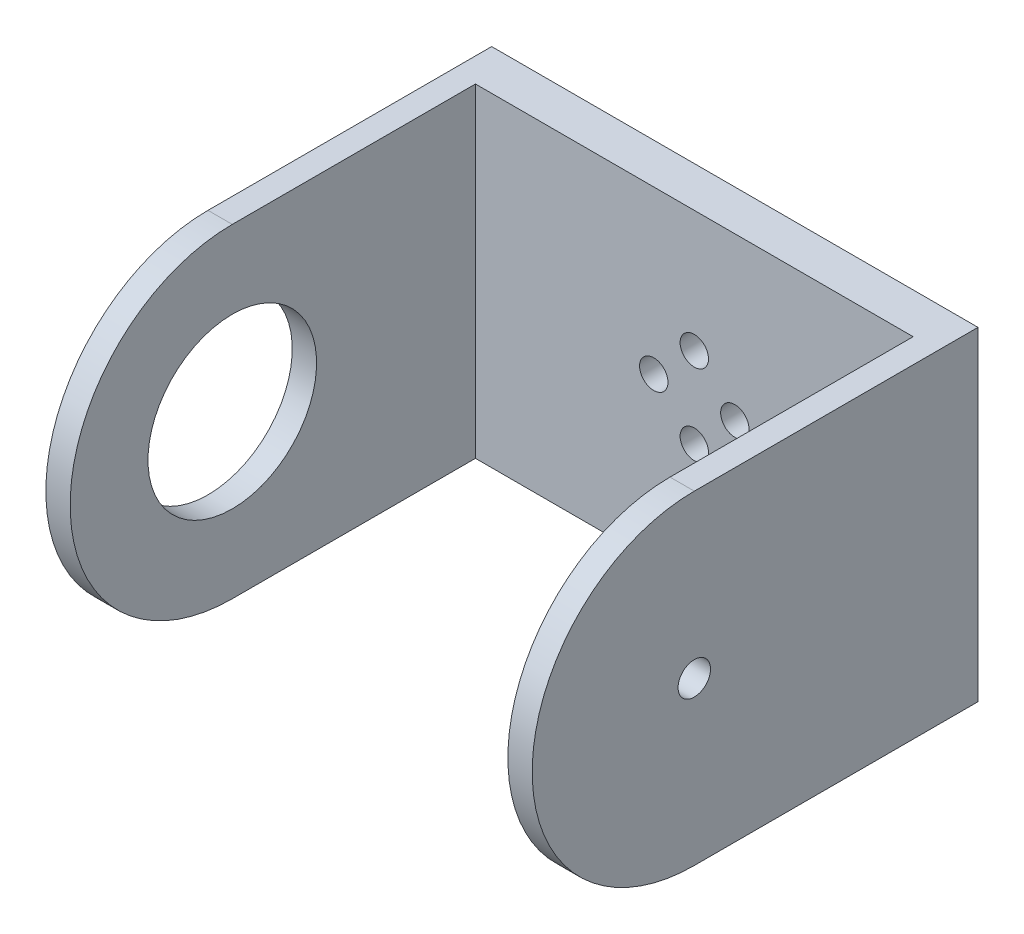
ISO-10303-21;
HEADER;
FILE_DESCRIPTION(('STEP AP214'),'2;1');
FILE_NAME('part.step','',(''),(''),'','','');
FILE_SCHEMA(('AUTOMOTIVE_DESIGN { 1 0 10303 214 1 1 1 1 }'));
ENDSEC;
DATA;
#1=APPLICATION_CONTEXT('core data for automotive mechanical design processes');
#2=APPLICATION_PROTOCOL_DEFINITION('international standard','automotive_design',2000,#1);
#3=PRODUCT_CONTEXT('',#1,'mechanical');
#4=PRODUCT('Part','Part','',(#3));
#5=PRODUCT_RELATED_PRODUCT_CATEGORY('part','',(#4));
#6=PRODUCT_DEFINITION_FORMATION('','',#4);
#7=PRODUCT_DEFINITION_CONTEXT('part definition',#1,'design');
#8=PRODUCT_DEFINITION('design','',#6,#7);
#9=PRODUCT_DEFINITION_SHAPE('','',#8);
#10=(LENGTH_UNIT() NAMED_UNIT(*) SI_UNIT(.MILLI.,.METRE.));
#11=(NAMED_UNIT(*) PLANE_ANGLE_UNIT() SI_UNIT($,.RADIAN.));
#12=(NAMED_UNIT(*) SI_UNIT($,.STERADIAN.) SOLID_ANGLE_UNIT());
#13=UNCERTAINTY_MEASURE_WITH_UNIT(LENGTH_MEASURE(1.E-05),#10,'distance_accuracy_value','');
#14=(GEOMETRIC_REPRESENTATION_CONTEXT(3) GLOBAL_UNCERTAINTY_ASSIGNED_CONTEXT((#13)) GLOBAL_UNIT_ASSIGNED_CONTEXT((#10,
#11,#12)) REPRESENTATION_CONTEXT('',''));
#15=CARTESIAN_POINT('',(0.,0.,0.));
#16=DIRECTION('',(0.,0.,1.));
#17=DIRECTION('',(1.,0.,0.));
#18=AXIS2_PLACEMENT_3D('',#15,#16,#17);
#19=CARTESIAN_POINT('',(30.,20.,5.));
#20=DIRECTION('',(-1.,0.,0.));
#21=DIRECTION('',(0.,-1.,0.));
#22=AXIS2_PLACEMENT_3D('',#19,#20,#21);
#23=PLANE('',#22);
#24=CARTESIAN_POINT('',(30.,0.,35.));
#25=DIRECTION('',(1.,0.,0.));
#26=DIRECTION('',(0.,1.,0.));
#27=AXIS2_PLACEMENT_3D('',#24,#25,#26);
#28=CIRCLE('',#27,2.);
#29=CARTESIAN_POINT('',(30.,1.99999999999999,35.));
#30=VERTEX_POINT('',#29);
#31=EDGE_CURVE('E247',#30,#30,#28,.T.);
#32=ORIENTED_EDGE('',*,*,#31,.F.);
#33=EDGE_LOOP('',(#32));
#34=FACE_BOUND('',#33,.T.);
#35=DIRECTION('',(0.,1.,0.));
#36=VECTOR('',#35,1.);
#37=CARTESIAN_POINT('',(30.,20.,0.));
#38=LINE('',#37,#36);
#39=CARTESIAN_POINT('',(30.,-20.,0.));
#40=VERTEX_POINT('',#39);
#41=CARTESIAN_POINT('',(30.,20.,0.));
#42=VERTEX_POINT('',#41);
#43=EDGE_CURVE('E170',#40,#42,#38,.T.);
#44=ORIENTED_EDGE('',*,*,#43,.T.);
#45=DIRECTION('',(0.,0.,-1.));
#46=VECTOR('',#45,1.);
#47=CARTESIAN_POINT('',(30.,20.,5.));
#48=LINE('',#47,#46);
#49=CARTESIAN_POINT('',(30.,20.,35.));
#50=VERTEX_POINT('',#49);
#51=EDGE_CURVE('E11',#50,#42,#48,.T.);
#52=ORIENTED_EDGE('',*,*,#51,.F.);
#53=CARTESIAN_POINT('',(30.,0.,35.));
#54=DIRECTION('',(1.,0.,0.));
#55=DIRECTION('',(0.,1.,0.));
#56=AXIS2_PLACEMENT_3D('',#53,#54,#55);
#57=CIRCLE('',#56,20.);
#58=CARTESIAN_POINT('',(30.,-20.,35.));
#59=VERTEX_POINT('',#58);
#60=EDGE_CURVE('E147',#50,#59,#57,.T.);
#61=ORIENTED_EDGE('',*,*,#60,.T.);
#62=DIRECTION('',(0.,0.,-1.));
#63=VECTOR('',#62,1.);
#64=CARTESIAN_POINT('',(30.,-20.,5.));
#65=LINE('',#64,#63);
#66=EDGE_CURVE('E135',#59,#40,#65,.T.);
#67=ORIENTED_EDGE('',*,*,#66,.T.);
#68=EDGE_LOOP('',(#44,#52,#61,#67));
#69=FACE_BOUND('',#68,.T.);
#70=ADVANCED_FACE('F47',(#34,#69),#23,.F.);
#71=CARTESIAN_POINT('',(-30.,20.,5.));
#72=DIRECTION('',(0.,-1.,0.));
#73=DIRECTION('',(0.,0.,-1.));
#74=AXIS2_PLACEMENT_3D('',#71,#72,#73);
#75=PLANE('',#74);
#76=DIRECTION('',(-1.,0.,0.));
#77=VECTOR('',#76,1.);
#78=CARTESIAN_POINT('',(-30.,20.,0.));
#79=LINE('',#78,#77);
#80=CARTESIAN_POINT('',(-30.,20.,0.));
#81=VERTEX_POINT('',#80);
#82=EDGE_CURVE('E198',#42,#81,#79,.T.);
#83=ORIENTED_EDGE('',*,*,#82,.T.);
#84=DIRECTION('',(0.,0.,-1.));
#85=VECTOR('',#84,1.);
#86=CARTESIAN_POINT('',(-30.,20.,5.));
#87=LINE('',#86,#85);
#88=CARTESIAN_POINT('',(-30.,20.,35.));
#89=VERTEX_POINT('',#88);
#90=EDGE_CURVE('E56',#89,#81,#87,.T.);
#91=ORIENTED_EDGE('',*,*,#90,.F.);
#92=DIRECTION('',(-1.,0.,0.));
#93=VECTOR('',#92,1.);
#94=CARTESIAN_POINT('',(-27.,20.,35.));
#95=LINE('',#94,#93);
#96=CARTESIAN_POINT('',(-27.,20.,35.));
#97=VERTEX_POINT('',#96);
#98=EDGE_CURVE('E125',#97,#89,#95,.T.);
#99=ORIENTED_EDGE('',*,*,#98,.F.);
#100=DIRECTION('',(0.,0.,-1.));
#101=VECTOR('',#100,1.);
#102=CARTESIAN_POINT('',(-27.,20.,35.));
#103=LINE('',#102,#101);
#104=CARTESIAN_POINT('',(-27.,20.,5.));
#105=VERTEX_POINT('',#104);
#106=EDGE_CURVE('E124',#97,#105,#103,.T.);
#107=ORIENTED_EDGE('',*,*,#106,.T.);
#108=DIRECTION('',(-1.,0.,0.));
#109=VECTOR('',#108,1.);
#110=CARTESIAN_POINT('',(-30.,20.,5.));
#111=LINE('',#110,#109);
#112=CARTESIAN_POINT('',(27.,20.,5.));
#113=VERTEX_POINT('',#112);
#114=EDGE_CURVE('E188',#113,#105,#111,.T.);
#115=ORIENTED_EDGE('',*,*,#114,.F.);
#116=DIRECTION('',(0.,0.,-1.));
#117=VECTOR('',#116,1.);
#118=CARTESIAN_POINT('',(27.,20.,35.));
#119=LINE('',#118,#117);
#120=CARTESIAN_POINT('',(27.,20.,35.));
#121=VERTEX_POINT('',#120);
#122=EDGE_CURVE('E157',#121,#113,#119,.T.);
#123=ORIENTED_EDGE('',*,*,#122,.F.);
#124=DIRECTION('',(-1.,0.,0.));
#125=VECTOR('',#124,1.);
#126=CARTESIAN_POINT('',(27.,20.,35.));
#127=LINE('',#126,#125);
#128=EDGE_CURVE('E181',#50,#121,#127,.T.);
#129=ORIENTED_EDGE('',*,*,#128,.F.);
#130=ORIENTED_EDGE('',*,*,#51,.T.);
#131=EDGE_LOOP('',(#83,#91,#99,#107,#115,#123,#129,#130));
#132=FACE_BOUND('',#131,.T.);
#133=ADVANCED_FACE('F223',(#132),#75,.F.);
#134=CARTESIAN_POINT('',(-30.,20.,5.));
#135=DIRECTION('',(1.,0.,0.));
#136=DIRECTION('',(0.,1.,0.));
#137=AXIS2_PLACEMENT_3D('',#134,#135,#136);
#138=PLANE('',#137);
#139=CARTESIAN_POINT('',(-30.,0.,35.));
#140=DIRECTION('',(1.,0.,0.));
#141=DIRECTION('',(0.,1.,0.));
#142=AXIS2_PLACEMENT_3D('',#139,#140,#141);
#143=CIRCLE('',#142,10.4);
#144=CARTESIAN_POINT('',(-30.,10.4,35.));
#145=VERTEX_POINT('',#144);
#146=EDGE_CURVE('E258',#145,#145,#143,.F.);
#147=ORIENTED_EDGE('',*,*,#146,.F.);
#148=EDGE_LOOP('',(#147));
#149=FACE_BOUND('',#148,.T.);
#150=DIRECTION('',(0.,-1.,0.));
#151=VECTOR('',#150,1.);
#152=CARTESIAN_POINT('',(-30.,20.,0.));
#153=LINE('',#152,#151);
#154=CARTESIAN_POINT('',(-30.,-20.,0.));
#155=VERTEX_POINT('',#154);
#156=EDGE_CURVE('E133',#81,#155,#153,.T.);
#157=ORIENTED_EDGE('',*,*,#156,.T.);
#158=DIRECTION('',(0.,0.,-1.));
#159=VECTOR('',#158,1.);
#160=CARTESIAN_POINT('',(-30.,-20.,5.));
#161=LINE('',#160,#159);
#162=CARTESIAN_POINT('',(-30.,-20.,35.0000000000002));
#163=VERTEX_POINT('',#162);
#164=EDGE_CURVE('E115',#163,#155,#161,.T.);
#165=ORIENTED_EDGE('',*,*,#164,.F.);
#166=CARTESIAN_POINT('',(-30.,0.,35.));
#167=DIRECTION('',(-1.,0.,0.));
#168=DIRECTION('',(0.,1.,0.));
#169=AXIS2_PLACEMENT_3D('',#166,#167,#168);
#170=CIRCLE('',#169,20.);
#171=EDGE_CURVE('E131',#163,#89,#170,.T.);
#172=ORIENTED_EDGE('',*,*,#171,.T.);
#173=ORIENTED_EDGE('',*,*,#90,.T.);
#174=EDGE_LOOP('',(#157,#165,#172,#173));
#175=FACE_BOUND('',#174,.T.);
#176=ADVANCED_FACE('F129',(#149,#175),#138,.F.);
#177=CARTESIAN_POINT('',(-30.,-20.,5.));
#178=DIRECTION('',(0.,1.,0.));
#179=DIRECTION('',(0.,0.,1.));
#180=AXIS2_PLACEMENT_3D('',#177,#178,#179);
#181=PLANE('',#180);
#182=DIRECTION('',(1.,0.,0.));
#183=VECTOR('',#182,1.);
#184=CARTESIAN_POINT('',(-30.,-20.,0.));
#185=LINE('',#184,#183);
#186=EDGE_CURVE('E192',#155,#40,#185,.T.);
#187=ORIENTED_EDGE('',*,*,#186,.T.);
#188=ORIENTED_EDGE('',*,*,#66,.F.);
#189=DIRECTION('',(1.,0.,0.));
#190=VECTOR('',#189,1.);
#191=CARTESIAN_POINT('',(30.,-20.,35.));
#192=LINE('',#191,#190);
#193=CARTESIAN_POINT('',(27.,-20.,35.));
#194=VERTEX_POINT('',#193);
#195=EDGE_CURVE('E178',#194,#59,#192,.T.);
#196=ORIENTED_EDGE('',*,*,#195,.F.);
#197=DIRECTION('',(0.,0.,-1.));
#198=VECTOR('',#197,1.);
#199=CARTESIAN_POINT('',(27.,-20.,35.));
#200=LINE('',#199,#198);
#201=CARTESIAN_POINT('',(27.,-20.,5.));
#202=VERTEX_POINT('',#201);
#203=EDGE_CURVE('E174',#194,#202,#200,.T.);
#204=ORIENTED_EDGE('',*,*,#203,.T.);
#205=DIRECTION('',(1.,0.,0.));
#206=VECTOR('',#205,1.);
#207=CARTESIAN_POINT('',(-30.,-20.,5.));
#208=LINE('',#207,#206);
#209=CARTESIAN_POINT('',(-27.,-20.,5.));
#210=VERTEX_POINT('',#209);
#211=EDGE_CURVE('E191',#210,#202,#208,.T.);
#212=ORIENTED_EDGE('',*,*,#211,.F.);
#213=DIRECTION('',(0.,0.,-1.));
#214=VECTOR('',#213,1.);
#215=CARTESIAN_POINT('',(-27.,-20.,35.));
#216=LINE('',#215,#214);
#217=CARTESIAN_POINT('',(-27.,-20.,35.));
#218=VERTEX_POINT('',#217);
#219=EDGE_CURVE('E118',#218,#210,#216,.T.);
#220=ORIENTED_EDGE('',*,*,#219,.F.);
#221=DIRECTION('',(1.,0.,0.));
#222=VECTOR('',#221,1.);
#223=CARTESIAN_POINT('',(-30.,-20.,35.));
#224=LINE('',#223,#222);
#225=EDGE_CURVE('E112',#163,#218,#224,.T.);
#226=ORIENTED_EDGE('',*,*,#225,.F.);
#227=ORIENTED_EDGE('',*,*,#164,.T.);
#228=EDGE_LOOP('',(#187,#188,#196,#204,#212,#220,#226,#227));
#229=FACE_BOUND('',#228,.T.);
#230=ADVANCED_FACE('F114',(#229),#181,.F.);
#231=CARTESIAN_POINT('',(0.,0.,5.));
#232=DIRECTION('',(0.,0.,1.));
#233=DIRECTION('',(1.,0.,0.));
#234=AXIS2_PLACEMENT_3D('',#231,#232,#233);
#235=PLANE('',#234);
#236=CARTESIAN_POINT('',(0.,5.,5.));
#237=DIRECTION('',(0.,0.,1.));
#238=DIRECTION('',(1.,0.,0.));
#239=AXIS2_PLACEMENT_3D('',#236,#237,#238);
#240=CIRCLE('',#239,1.75);
#241=CARTESIAN_POINT('',(-1.75,5.,5.));
#242=VERTEX_POINT('',#241);
#243=EDGE_CURVE('E142',#242,#242,#240,.T.);
#244=ORIENTED_EDGE('',*,*,#243,.F.);
#245=EDGE_LOOP('',(#244));
#246=FACE_BOUND('',#245,.T.);
#247=CARTESIAN_POINT('',(5.,0.,5.));
#248=DIRECTION('',(0.,0.,1.));
#249=DIRECTION('',(1.,0.,0.));
#250=AXIS2_PLACEMENT_3D('',#247,#248,#249);
#251=CIRCLE('',#250,1.75);
#252=CARTESIAN_POINT('',(3.25,0.,5.));
#253=VERTEX_POINT('',#252);
#254=EDGE_CURVE('E150',#253,#253,#251,.T.);
#255=ORIENTED_EDGE('',*,*,#254,.F.);
#256=EDGE_LOOP('',(#255));
#257=FACE_BOUND('',#256,.T.);
#258=CARTESIAN_POINT('',(0.,-5.,5.));
#259=DIRECTION('',(0.,0.,1.));
#260=DIRECTION('',(1.,0.,0.));
#261=AXIS2_PLACEMENT_3D('',#258,#259,#260);
#262=CIRCLE('',#261,1.75);
#263=CARTESIAN_POINT('',(-1.75,-5.,5.));
#264=VERTEX_POINT('',#263);
#265=EDGE_CURVE('E282',#264,#264,#262,.T.);
#266=ORIENTED_EDGE('',*,*,#265,.F.);
#267=EDGE_LOOP('',(#266));
#268=FACE_BOUND('',#267,.T.);
#269=CARTESIAN_POINT('',(-5.,0.,5.));
#270=DIRECTION('',(0.,0.,1.));
#271=DIRECTION('',(1.,0.,0.));
#272=AXIS2_PLACEMENT_3D('',#269,#270,#271);
#273=CIRCLE('',#272,1.75);
#274=CARTESIAN_POINT('',(-6.75,0.,5.));
#275=VERTEX_POINT('',#274);
#276=EDGE_CURVE('E267',#275,#275,#273,.T.);
#277=ORIENTED_EDGE('',*,*,#276,.F.);
#278=EDGE_LOOP('',(#277));
#279=FACE_BOUND('',#278,.T.);
#280=DIRECTION('',(0.,1.,0.));
#281=VECTOR('',#280,1.);
#282=CARTESIAN_POINT('',(-27.,-20.,5.));
#283=LINE('',#282,#281);
#284=EDGE_CURVE('E63',#210,#105,#283,.T.);
#285=ORIENTED_EDGE('',*,*,#284,.F.);
#286=ORIENTED_EDGE('',*,*,#211,.T.);
#287=DIRECTION('',(0.,-1.,0.));
#288=VECTOR('',#287,1.);
#289=CARTESIAN_POINT('',(27.,-20.,5.));
#290=LINE('',#289,#288);
#291=EDGE_CURVE('E68',#113,#202,#290,.T.);
#292=ORIENTED_EDGE('',*,*,#291,.F.);
#293=ORIENTED_EDGE('',*,*,#114,.T.);
#294=EDGE_LOOP('',(#285,#286,#292,#293));
#295=FACE_BOUND('',#294,.T.);
#296=ADVANCED_FACE('F224',(#246,#257,#268,#279,#295),#235,.T.);
#297=CARTESIAN_POINT('',(0.,0.,0.));
#298=DIRECTION('',(0.,0.,1.));
#299=DIRECTION('',(1.,0.,0.));
#300=AXIS2_PLACEMENT_3D('',#297,#298,#299);
#301=PLANE('',#300);
#302=CARTESIAN_POINT('',(0.,5.,0.));
#303=DIRECTION('',(0.,0.,-1.));
#304=DIRECTION('',(-1.,0.,0.));
#305=AXIS2_PLACEMENT_3D('',#302,#303,#304);
#306=CIRCLE('',#305,1.75);
#307=CARTESIAN_POINT('',(-1.75,5.,0.));
#308=VERTEX_POINT('',#307);
#309=EDGE_CURVE('E263',#308,#308,#306,.T.);
#310=ORIENTED_EDGE('',*,*,#309,.F.);
#311=EDGE_LOOP('',(#310));
#312=FACE_BOUND('',#311,.T.);
#313=CARTESIAN_POINT('',(5.,0.,0.));
#314=DIRECTION('',(0.,0.,-1.));
#315=DIRECTION('',(-1.,0.,0.));
#316=AXIS2_PLACEMENT_3D('',#313,#314,#315);
#317=CIRCLE('',#316,1.75);
#318=CARTESIAN_POINT('',(3.25,0.,0.));
#319=VERTEX_POINT('',#318);
#320=EDGE_CURVE('E268',#319,#319,#317,.T.);
#321=ORIENTED_EDGE('',*,*,#320,.F.);
#322=EDGE_LOOP('',(#321));
#323=FACE_BOUND('',#322,.T.);
#324=CARTESIAN_POINT('',(0.,-5.,0.));
#325=DIRECTION('',(0.,0.,-1.));
#326=DIRECTION('',(1.,0.,0.));
#327=AXIS2_PLACEMENT_3D('',#324,#325,#326);
#328=CIRCLE('',#327,1.75);
#329=CARTESIAN_POINT('',(-1.75,-5.,0.));
#330=VERTEX_POINT('',#329);
#331=EDGE_CURVE('E272',#330,#330,#328,.T.);
#332=ORIENTED_EDGE('',*,*,#331,.F.);
#333=EDGE_LOOP('',(#332));
#334=FACE_BOUND('',#333,.T.);
#335=CARTESIAN_POINT('',(-5.,0.,0.));
#336=DIRECTION('',(0.,0.,-1.));
#337=DIRECTION('',(1.,0.,0.));
#338=AXIS2_PLACEMENT_3D('',#335,#336,#337);
#339=CIRCLE('',#338,1.75);
#340=CARTESIAN_POINT('',(-6.75,0.,0.));
#341=VERTEX_POINT('',#340);
#342=EDGE_CURVE('E262',#341,#341,#339,.T.);
#343=ORIENTED_EDGE('',*,*,#342,.F.);
#344=EDGE_LOOP('',(#343));
#345=FACE_BOUND('',#344,.T.);
#346=ORIENTED_EDGE('',*,*,#43,.F.);
#347=ORIENTED_EDGE('',*,*,#186,.F.);
#348=ORIENTED_EDGE('',*,*,#156,.F.);
#349=ORIENTED_EDGE('',*,*,#82,.F.);
#350=EDGE_LOOP('',(#346,#347,#348,#349));
#351=FACE_BOUND('',#350,.T.);
#352=ADVANCED_FACE('F213',(#312,#323,#334,#345,#351),#301,.F.);
#353=CARTESIAN_POINT('',(27.,-20.,35.));
#354=DIRECTION('',(1.,0.,0.));
#355=DIRECTION('',(0.,1.,0.));
#356=AXIS2_PLACEMENT_3D('',#353,#354,#355);
#357=PLANE('',#356);
#358=CARTESIAN_POINT('',(27.,0.,35.));
#359=DIRECTION('',(1.,0.,0.));
#360=DIRECTION('',(0.,1.,0.));
#361=AXIS2_PLACEMENT_3D('',#358,#359,#360);
#362=CIRCLE('',#361,2.);
#363=CARTESIAN_POINT('',(27.,1.99999999999999,35.));
#364=VERTEX_POINT('',#363);
#365=EDGE_CURVE('E50',#364,#364,#362,.T.);
#366=ORIENTED_EDGE('',*,*,#365,.T.);
#367=EDGE_LOOP('',(#366));
#368=FACE_BOUND('',#367,.T.);
#369=ORIENTED_EDGE('',*,*,#291,.T.);
#370=ORIENTED_EDGE('',*,*,#203,.F.);
#371=CARTESIAN_POINT('',(27.,0.,35.));
#372=DIRECTION('',(1.,0.,0.));
#373=DIRECTION('',(0.,1.,0.));
#374=AXIS2_PLACEMENT_3D('',#371,#372,#373);
#375=CIRCLE('',#374,20.);
#376=EDGE_CURVE('E153',#121,#194,#375,.T.);
#377=ORIENTED_EDGE('',*,*,#376,.F.);
#378=ORIENTED_EDGE('',*,*,#122,.T.);
#379=EDGE_LOOP('',(#369,#370,#377,#378));
#380=FACE_BOUND('',#379,.T.);
#381=ADVANCED_FACE('F222',(#368,#380),#357,.F.);
#382=CARTESIAN_POINT('',(-27.,-20.,35.));
#383=DIRECTION('',(-1.,0.,0.));
#384=DIRECTION('',(0.,0.,1.));
#385=AXIS2_PLACEMENT_3D('',#382,#383,#384);
#386=PLANE('',#385);
#387=CARTESIAN_POINT('',(-27.,0.,35.));
#388=DIRECTION('',(-1.,0.,0.));
#389=DIRECTION('',(0.,-1.,0.));
#390=AXIS2_PLACEMENT_3D('',#387,#388,#389);
#391=CIRCLE('',#390,10.4);
#392=CARTESIAN_POINT('',(-27.,10.4,35.));
#393=VERTEX_POINT('',#392);
#394=EDGE_CURVE('E254',#393,#393,#391,.T.);
#395=ORIENTED_EDGE('',*,*,#394,.T.);
#396=EDGE_LOOP('',(#395));
#397=FACE_BOUND('',#396,.T.);
#398=ORIENTED_EDGE('',*,*,#284,.T.);
#399=ORIENTED_EDGE('',*,*,#106,.F.);
#400=CARTESIAN_POINT('',(-27.,0.,35.));
#401=DIRECTION('',(-1.,0.,0.));
#402=DIRECTION('',(0.,1.,0.));
#403=AXIS2_PLACEMENT_3D('',#400,#401,#402);
#404=CIRCLE('',#403,20.);
#405=EDGE_CURVE('E141',#218,#97,#404,.T.);
#406=ORIENTED_EDGE('',*,*,#405,.F.);
#407=ORIENTED_EDGE('',*,*,#219,.T.);
#408=EDGE_LOOP('',(#398,#399,#406,#407));
#409=FACE_BOUND('',#408,.T.);
#410=ADVANCED_FACE('F226',(#397,#409),#386,.F.);
#411=CARTESIAN_POINT('',(27.,0.,35.));
#412=DIRECTION('',(1.,0.,0.));
#413=DIRECTION('',(0.,1.,0.));
#414=AXIS2_PLACEMENT_3D('',#411,#412,#413);
#415=CYLINDRICAL_SURFACE('',#414,20.);
#416=ORIENTED_EDGE('',*,*,#60,.F.);
#417=ORIENTED_EDGE('',*,*,#128,.T.);
#418=ORIENTED_EDGE('',*,*,#376,.T.);
#419=ORIENTED_EDGE('',*,*,#195,.T.);
#420=EDGE_LOOP('',(#416,#417,#418,#419));
#421=FACE_BOUND('',#420,.T.);
#422=ADVANCED_FACE('F219',(#421),#415,.T.);
#423=CARTESIAN_POINT('',(-27.,0.,35.));
#424=DIRECTION('',(-1.,0.,0.));
#425=DIRECTION('',(0.,-1.,0.));
#426=AXIS2_PLACEMENT_3D('',#423,#424,#425);
#427=CYLINDRICAL_SURFACE('',#426,20.);
#428=ORIENTED_EDGE('',*,*,#171,.F.);
#429=ORIENTED_EDGE('',*,*,#225,.T.);
#430=ORIENTED_EDGE('',*,*,#405,.T.);
#431=ORIENTED_EDGE('',*,*,#98,.T.);
#432=EDGE_LOOP('',(#428,#429,#430,#431));
#433=FACE_BOUND('',#432,.T.);
#434=ADVANCED_FACE('F138',(#433),#427,.T.);
#435=CARTESIAN_POINT('',(-5.,0.,55.));
#436=DIRECTION('',(0.,0.,-1.));
#437=DIRECTION('',(-1.,0.,0.));
#438=AXIS2_PLACEMENT_3D('',#435,#436,#437);
#439=CYLINDRICAL_SURFACE('',#438,1.75);
#440=CARTESIAN_POINT('',(-6.75,0.,5.));
#441=CARTESIAN_POINT('',(-6.75,0.,4.94791666666667));
#442=CARTESIAN_POINT('',(-6.75,0.,4.89583333333333));
#443=CARTESIAN_POINT('',(-6.75,0.,4.79166666666667));
#444=CARTESIAN_POINT('',(-6.75,0.,4.73958333333333));
#445=CARTESIAN_POINT('',(-6.75,0.,4.63541666666667));
#446=CARTESIAN_POINT('',(-6.75,0.,4.58333333333333));
#447=CARTESIAN_POINT('',(-6.75,0.,4.47916666666667));
#448=CARTESIAN_POINT('',(-6.75,0.,4.42708333333333));
#449=CARTESIAN_POINT('',(-6.75,0.,4.32291666666667));
#450=CARTESIAN_POINT('',(-6.75,0.,4.27083333333333));
#451=CARTESIAN_POINT('',(-6.75,0.,4.16666666666667));
#452=CARTESIAN_POINT('',(-6.75,0.,4.11458333333333));
#453=CARTESIAN_POINT('',(-6.75,0.,4.01041666666666));
#454=CARTESIAN_POINT('',(-6.75,0.,3.95833333333333));
#455=CARTESIAN_POINT('',(-6.75,0.,3.85416666666667));
#456=CARTESIAN_POINT('',(-6.75,0.,3.80208333333333));
#457=CARTESIAN_POINT('',(-6.75,0.,3.69791666666666));
#458=CARTESIAN_POINT('',(-6.75,0.,3.64583333333333));
#459=CARTESIAN_POINT('',(-6.75,0.,3.54166666666667));
#460=CARTESIAN_POINT('',(-6.75,0.,3.48958333333334));
#461=CARTESIAN_POINT('',(-6.75,0.,3.38541666666667));
#462=CARTESIAN_POINT('',(-6.75,0.,3.33333333333333));
#463=CARTESIAN_POINT('',(-6.75,0.,3.22916666666667));
#464=CARTESIAN_POINT('',(-6.75,0.,3.17708333333334));
#465=CARTESIAN_POINT('',(-6.75,0.,3.07291666666667));
#466=CARTESIAN_POINT('',(-6.75,0.,3.02083333333333));
#467=CARTESIAN_POINT('',(-6.75,0.,2.91666666666667));
#468=CARTESIAN_POINT('',(-6.75,0.,2.86458333333333));
#469=CARTESIAN_POINT('',(-6.75,0.,2.76041666666667));
#470=CARTESIAN_POINT('',(-6.75,0.,2.70833333333333));
#471=CARTESIAN_POINT('',(-6.75,0.,2.60416666666667));
#472=CARTESIAN_POINT('',(-6.75,0.,2.55208333333333));
#473=CARTESIAN_POINT('',(-6.75,0.,2.44791666666667));
#474=CARTESIAN_POINT('',(-6.75,0.,2.39583333333334));
#475=CARTESIAN_POINT('',(-6.75,0.,2.29166666666667));
#476=CARTESIAN_POINT('',(-6.75,0.,2.23958333333334));
#477=CARTESIAN_POINT('',(-6.75,0.,2.13541666666667));
#478=CARTESIAN_POINT('',(-6.75,0.,2.08333333333334));
#479=CARTESIAN_POINT('',(-6.75,0.,1.97916666666667));
#480=CARTESIAN_POINT('',(-6.75,0.,1.92708333333334));
#481=CARTESIAN_POINT('',(-6.75,0.,1.82291666666667));
#482=CARTESIAN_POINT('',(-6.75,0.,1.77083333333334));
#483=CARTESIAN_POINT('',(-6.75,0.,1.66666666666667));
#484=CARTESIAN_POINT('',(-6.75,0.,1.61458333333334));
#485=CARTESIAN_POINT('',(-6.75,0.,1.51041666666667));
#486=CARTESIAN_POINT('',(-6.75,0.,1.45833333333334));
#487=CARTESIAN_POINT('',(-6.75,0.,1.35416666666667));
#488=CARTESIAN_POINT('',(-6.75,0.,1.30208333333334));
#489=CARTESIAN_POINT('',(-6.75,0.,1.19791666666667));
#490=CARTESIAN_POINT('',(-6.75,0.,1.14583333333334));
#491=CARTESIAN_POINT('',(-6.75,0.,1.04166666666667));
#492=CARTESIAN_POINT('',(-6.75,0.,0.98958333333334));
#493=CARTESIAN_POINT('',(-6.75,0.,0.885416666666673));
#494=CARTESIAN_POINT('',(-6.75,0.,0.833333333333339));
#495=CARTESIAN_POINT('',(-6.75,0.,0.729166666666672));
#496=CARTESIAN_POINT('',(-6.75,0.,0.67708333333334));
#497=CARTESIAN_POINT('',(-6.75,0.,0.572916666666673));
#498=CARTESIAN_POINT('',(-6.75,0.,0.520833333333338));
#499=CARTESIAN_POINT('',(-6.75,0.,0.416666666666672));
#500=CARTESIAN_POINT('',(-6.75,0.,0.364583333333339));
#501=CARTESIAN_POINT('',(-6.75,0.,0.260416666666673));
#502=CARTESIAN_POINT('',(-6.75,0.,0.208333333333338));
#503=CARTESIAN_POINT('',(-6.75,0.,0.104166666666671));
#504=CARTESIAN_POINT('',(-6.75,0.,0.0520833333333392));
#505=CARTESIAN_POINT('',(-6.75,0.,0.));
#506=B_SPLINE_CURVE_WITH_KNOTS('',3,(#440,#441,#442,#443,#444,#445,#446,#447,#448,#449,#450,
#451,#452,#453,#454,#455,#456,#457,#458,#459,#460,#461,#462,#463,#464,#465,#466,#467,#468,#469,
#470,#471,#472,#473,#474,#475,#476,#477,#478,#479,#480,#481,#482,#483,#484,#485,#486,#487,#488,
#489,#490,#491,#492,#493,#494,#495,#496,#497,#498,#499,#500,#501,#502,#503,#504,#505),
.UNSPECIFIED.,.F.,.F.,(4,2,2,2,2,2,2,2,2,2,2,2,2,2,2,2,2,2,2,2,2,2,2,2,2,2,2,2,2,2,2,2,4),(0.,
0.156249999999997,0.3125,0.468749999999997,0.625000000000001,0.781249999999997,
0.937500000000001,1.09375,1.25,1.40625,1.56249999999999,1.71875,1.87499999999999,2.03125,2.1875,
2.34375,2.5,2.65624999999999,2.8125,2.96874999999999,3.125,3.28124999999999,3.4375,
3.59374999999999,3.74999999999999,3.90624999999999,4.06249999999999,4.21874999999999,
4.37499999999999,4.53124999999999,4.68749999999999,4.84374999999999,4.99999999999999),.UNSPECIFIED.);
#507=EDGE_CURVE('BSEAM302',#275,#341,#506,.T.);
#508=ORIENTED_EDGE('',*,*,#276,.T.);
#509=ORIENTED_EDGE('',*,*,#342,.T.);
#510=ORIENTED_EDGE('',*,*,#507,.T.);
#511=ORIENTED_EDGE('',*,*,#507,.F.);
#512=EDGE_LOOP('',(#508,#510,#509,#511));
#513=FACE_BOUND('',#512,.T.);
#514=ADVANCED_FACE('F302',(#513),#439,.F.);
#515=CARTESIAN_POINT('',(0.,-5.,55.));
#516=DIRECTION('',(0.,0.,-1.));
#517=DIRECTION('',(-1.,0.,0.));
#518=AXIS2_PLACEMENT_3D('',#515,#516,#517);
#519=CYLINDRICAL_SURFACE('',#518,1.75);
#520=CARTESIAN_POINT('',(-1.75,-5.,5.));
#521=CARTESIAN_POINT('',(-1.75,-5.,4.94791666666667));
#522=CARTESIAN_POINT('',(-1.75,-5.,4.89583333333333));
#523=CARTESIAN_POINT('',(-1.75,-5.,4.79166666666667));
#524=CARTESIAN_POINT('',(-1.75,-5.,4.73958333333333));
#525=CARTESIAN_POINT('',(-1.75,-5.,4.63541666666667));
#526=CARTESIAN_POINT('',(-1.75,-5.,4.58333333333333));
#527=CARTESIAN_POINT('',(-1.75,-5.,4.47916666666667));
#528=CARTESIAN_POINT('',(-1.75,-5.,4.42708333333333));
#529=CARTESIAN_POINT('',(-1.75,-5.,4.32291666666667));
#530=CARTESIAN_POINT('',(-1.75,-5.,4.27083333333333));
#531=CARTESIAN_POINT('',(-1.75,-5.,4.16666666666667));
#532=CARTESIAN_POINT('',(-1.75,-5.,4.11458333333333));
#533=CARTESIAN_POINT('',(-1.75,-5.,4.01041666666666));
#534=CARTESIAN_POINT('',(-1.75,-5.,3.95833333333333));
#535=CARTESIAN_POINT('',(-1.75,-5.,3.85416666666667));
#536=CARTESIAN_POINT('',(-1.75,-5.,3.80208333333333));
#537=CARTESIAN_POINT('',(-1.75,-5.,3.69791666666666));
#538=CARTESIAN_POINT('',(-1.75,-5.,3.64583333333333));
#539=CARTESIAN_POINT('',(-1.75,-5.,3.54166666666667));
#540=CARTESIAN_POINT('',(-1.75,-5.,3.48958333333334));
#541=CARTESIAN_POINT('',(-1.75,-5.,3.38541666666667));
#542=CARTESIAN_POINT('',(-1.75,-5.,3.33333333333333));
#543=CARTESIAN_POINT('',(-1.75,-5.,3.22916666666667));
#544=CARTESIAN_POINT('',(-1.75,-5.,3.17708333333334));
#545=CARTESIAN_POINT('',(-1.75,-5.,3.07291666666667));
#546=CARTESIAN_POINT('',(-1.75,-5.,3.02083333333333));
#547=CARTESIAN_POINT('',(-1.75,-5.,2.91666666666667));
#548=CARTESIAN_POINT('',(-1.75,-5.,2.86458333333333));
#549=CARTESIAN_POINT('',(-1.75,-5.,2.76041666666667));
#550=CARTESIAN_POINT('',(-1.75,-5.,2.70833333333333));
#551=CARTESIAN_POINT('',(-1.75,-5.,2.60416666666667));
#552=CARTESIAN_POINT('',(-1.75,-5.,2.55208333333333));
#553=CARTESIAN_POINT('',(-1.75,-5.,2.44791666666667));
#554=CARTESIAN_POINT('',(-1.75,-5.,2.39583333333334));
#555=CARTESIAN_POINT('',(-1.75,-5.,2.29166666666667));
#556=CARTESIAN_POINT('',(-1.75,-5.,2.23958333333334));
#557=CARTESIAN_POINT('',(-1.75,-5.,2.13541666666667));
#558=CARTESIAN_POINT('',(-1.75,-5.,2.08333333333334));
#559=CARTESIAN_POINT('',(-1.75,-5.,1.97916666666667));
#560=CARTESIAN_POINT('',(-1.75,-5.,1.92708333333334));
#561=CARTESIAN_POINT('',(-1.75,-5.,1.82291666666667));
#562=CARTESIAN_POINT('',(-1.75,-5.,1.77083333333334));
#563=CARTESIAN_POINT('',(-1.75,-5.,1.66666666666667));
#564=CARTESIAN_POINT('',(-1.75,-5.,1.61458333333334));
#565=CARTESIAN_POINT('',(-1.75,-5.,1.51041666666667));
#566=CARTESIAN_POINT('',(-1.75,-5.,1.45833333333334));
#567=CARTESIAN_POINT('',(-1.75,-5.,1.35416666666667));
#568=CARTESIAN_POINT('',(-1.75,-5.,1.30208333333334));
#569=CARTESIAN_POINT('',(-1.75,-5.,1.19791666666667));
#570=CARTESIAN_POINT('',(-1.75,-5.,1.14583333333334));
#571=CARTESIAN_POINT('',(-1.75,-5.,1.04166666666667));
#572=CARTESIAN_POINT('',(-1.75,-5.,0.98958333333334));
#573=CARTESIAN_POINT('',(-1.75,-5.,0.885416666666673));
#574=CARTESIAN_POINT('',(-1.75,-5.,0.833333333333339));
#575=CARTESIAN_POINT('',(-1.75,-5.,0.729166666666672));
#576=CARTESIAN_POINT('',(-1.75,-5.,0.67708333333334));
#577=CARTESIAN_POINT('',(-1.75,-5.,0.572916666666673));
#578=CARTESIAN_POINT('',(-1.75,-5.,0.520833333333338));
#579=CARTESIAN_POINT('',(-1.75,-5.,0.416666666666672));
#580=CARTESIAN_POINT('',(-1.75,-5.,0.364583333333339));
#581=CARTESIAN_POINT('',(-1.75,-5.,0.260416666666673));
#582=CARTESIAN_POINT('',(-1.75,-5.,0.208333333333338));
#583=CARTESIAN_POINT('',(-1.75,-5.,0.104166666666671));
#584=CARTESIAN_POINT('',(-1.75,-5.,0.0520833333333392));
#585=CARTESIAN_POINT('',(-1.75,-5.,0.));
#586=B_SPLINE_CURVE_WITH_KNOTS('',3,(#520,#521,#522,#523,#524,#525,#526,#527,#528,#529,#530,
#531,#532,#533,#534,#535,#536,#537,#538,#539,#540,#541,#542,#543,#544,#545,#546,#547,#548,#549,
#550,#551,#552,#553,#554,#555,#556,#557,#558,#559,#560,#561,#562,#563,#564,#565,#566,#567,#568,
#569,#570,#571,#572,#573,#574,#575,#576,#577,#578,#579,#580,#581,#582,#583,#584,#585),
.UNSPECIFIED.,.F.,.F.,(4,2,2,2,2,2,2,2,2,2,2,2,2,2,2,2,2,2,2,2,2,2,2,2,2,2,2,2,2,2,2,2,4),(0.,
0.156249999999997,0.3125,0.468749999999997,0.625000000000001,0.781249999999997,
0.937500000000001,1.09375,1.25,1.40625,1.56249999999999,1.71875,1.87499999999999,2.03125,2.1875,
2.34375,2.5,2.65624999999999,2.8125,2.96874999999999,3.125,3.28124999999999,3.4375,
3.59374999999999,3.74999999999999,3.90624999999999,4.06249999999999,4.21874999999999,
4.37499999999999,4.53124999999999,4.68749999999999,4.84374999999999,4.99999999999999),.UNSPECIFIED.);
#587=EDGE_CURVE('BSEAM305',#264,#330,#586,.T.);
#588=ORIENTED_EDGE('',*,*,#265,.T.);
#589=ORIENTED_EDGE('',*,*,#331,.T.);
#590=ORIENTED_EDGE('',*,*,#587,.T.);
#591=ORIENTED_EDGE('',*,*,#587,.F.);
#592=EDGE_LOOP('',(#588,#590,#589,#591));
#593=FACE_BOUND('',#592,.T.);
#594=ADVANCED_FACE('F305',(#593),#519,.F.);
#595=CARTESIAN_POINT('',(5.,0.,55.));
#596=DIRECTION('',(0.,0.,-1.));
#597=DIRECTION('',(-1.,0.,0.));
#598=AXIS2_PLACEMENT_3D('',#595,#596,#597);
#599=CYLINDRICAL_SURFACE('',#598,1.75);
#600=CARTESIAN_POINT('',(3.25,0.,5.));
#601=CARTESIAN_POINT('',(3.25,0.,4.94791666666667));
#602=CARTESIAN_POINT('',(3.25,0.,4.89583333333333));
#603=CARTESIAN_POINT('',(3.25,0.,4.79166666666667));
#604=CARTESIAN_POINT('',(3.25,0.,4.73958333333333));
#605=CARTESIAN_POINT('',(3.25,0.,4.63541666666667));
#606=CARTESIAN_POINT('',(3.25,0.,4.58333333333333));
#607=CARTESIAN_POINT('',(3.25,0.,4.47916666666667));
#608=CARTESIAN_POINT('',(3.25,0.,4.42708333333333));
#609=CARTESIAN_POINT('',(3.25,0.,4.32291666666667));
#610=CARTESIAN_POINT('',(3.25,0.,4.27083333333333));
#611=CARTESIAN_POINT('',(3.25,0.,4.16666666666667));
#612=CARTESIAN_POINT('',(3.25,0.,4.11458333333333));
#613=CARTESIAN_POINT('',(3.25,0.,4.01041666666666));
#614=CARTESIAN_POINT('',(3.25,0.,3.95833333333333));
#615=CARTESIAN_POINT('',(3.25,0.,3.85416666666667));
#616=CARTESIAN_POINT('',(3.25,0.,3.80208333333333));
#617=CARTESIAN_POINT('',(3.25,0.,3.69791666666666));
#618=CARTESIAN_POINT('',(3.25,0.,3.64583333333333));
#619=CARTESIAN_POINT('',(3.25,0.,3.54166666666667));
#620=CARTESIAN_POINT('',(3.25,0.,3.48958333333334));
#621=CARTESIAN_POINT('',(3.25,0.,3.38541666666667));
#622=CARTESIAN_POINT('',(3.25,0.,3.33333333333333));
#623=CARTESIAN_POINT('',(3.25,0.,3.22916666666667));
#624=CARTESIAN_POINT('',(3.25,0.,3.17708333333334));
#625=CARTESIAN_POINT('',(3.25,0.,3.07291666666667));
#626=CARTESIAN_POINT('',(3.25,0.,3.02083333333333));
#627=CARTESIAN_POINT('',(3.25,0.,2.91666666666667));
#628=CARTESIAN_POINT('',(3.25,0.,2.86458333333333));
#629=CARTESIAN_POINT('',(3.25,0.,2.76041666666667));
#630=CARTESIAN_POINT('',(3.25,0.,2.70833333333333));
#631=CARTESIAN_POINT('',(3.25,0.,2.60416666666667));
#632=CARTESIAN_POINT('',(3.25,0.,2.55208333333333));
#633=CARTESIAN_POINT('',(3.25,0.,2.44791666666667));
#634=CARTESIAN_POINT('',(3.25,0.,2.39583333333334));
#635=CARTESIAN_POINT('',(3.25,0.,2.29166666666667));
#636=CARTESIAN_POINT('',(3.25,0.,2.23958333333334));
#637=CARTESIAN_POINT('',(3.25,0.,2.13541666666667));
#638=CARTESIAN_POINT('',(3.25,0.,2.08333333333334));
#639=CARTESIAN_POINT('',(3.25,0.,1.97916666666667));
#640=CARTESIAN_POINT('',(3.25,0.,1.92708333333334));
#641=CARTESIAN_POINT('',(3.25,0.,1.82291666666667));
#642=CARTESIAN_POINT('',(3.25,0.,1.77083333333334));
#643=CARTESIAN_POINT('',(3.25,0.,1.66666666666667));
#644=CARTESIAN_POINT('',(3.25,0.,1.61458333333334));
#645=CARTESIAN_POINT('',(3.25,0.,1.51041666666667));
#646=CARTESIAN_POINT('',(3.25,0.,1.45833333333334));
#647=CARTESIAN_POINT('',(3.25,0.,1.35416666666667));
#648=CARTESIAN_POINT('',(3.25,0.,1.30208333333334));
#649=CARTESIAN_POINT('',(3.25,0.,1.19791666666667));
#650=CARTESIAN_POINT('',(3.25,0.,1.14583333333334));
#651=CARTESIAN_POINT('',(3.25,0.,1.04166666666667));
#652=CARTESIAN_POINT('',(3.25,0.,0.98958333333334));
#653=CARTESIAN_POINT('',(3.25,0.,0.885416666666673));
#654=CARTESIAN_POINT('',(3.25,0.,0.833333333333339));
#655=CARTESIAN_POINT('',(3.25,0.,0.729166666666672));
#656=CARTESIAN_POINT('',(3.25,0.,0.67708333333334));
#657=CARTESIAN_POINT('',(3.25,0.,0.572916666666673));
#658=CARTESIAN_POINT('',(3.25,0.,0.520833333333338));
#659=CARTESIAN_POINT('',(3.25,0.,0.416666666666672));
#660=CARTESIAN_POINT('',(3.25,0.,0.364583333333339));
#661=CARTESIAN_POINT('',(3.25,0.,0.260416666666673));
#662=CARTESIAN_POINT('',(3.25,0.,0.208333333333338));
#663=CARTESIAN_POINT('',(3.25,0.,0.104166666666671));
#664=CARTESIAN_POINT('',(3.25,0.,0.0520833333333392));
#665=CARTESIAN_POINT('',(3.25,0.,0.));
#666=B_SPLINE_CURVE_WITH_KNOTS('',3,(#600,#601,#602,#603,#604,#605,#606,#607,#608,#609,#610,
#611,#612,#613,#614,#615,#616,#617,#618,#619,#620,#621,#622,#623,#624,#625,#626,#627,#628,#629,
#630,#631,#632,#633,#634,#635,#636,#637,#638,#639,#640,#641,#642,#643,#644,#645,#646,#647,#648,
#649,#650,#651,#652,#653,#654,#655,#656,#657,#658,#659,#660,#661,#662,#663,#664,#665),
.UNSPECIFIED.,.F.,.F.,(4,2,2,2,2,2,2,2,2,2,2,2,2,2,2,2,2,2,2,2,2,2,2,2,2,2,2,2,2,2,2,2,4),(0.,
0.156249999999997,0.3125,0.468749999999997,0.625000000000001,0.781249999999997,
0.937500000000001,1.09375,1.25,1.40625,1.56249999999999,1.71875,1.87499999999999,2.03125,2.1875,
2.34375,2.5,2.65624999999999,2.8125,2.96874999999999,3.125,3.28124999999999,3.4375,
3.59374999999999,3.74999999999999,3.90624999999999,4.06249999999999,4.21874999999999,
4.37499999999999,4.53124999999999,4.68749999999999,4.84374999999999,4.99999999999999),.UNSPECIFIED.);
#667=EDGE_CURVE('BSEAM291',#253,#319,#666,.T.);
#668=ORIENTED_EDGE('',*,*,#254,.T.);
#669=ORIENTED_EDGE('',*,*,#320,.T.);
#670=ORIENTED_EDGE('',*,*,#667,.T.);
#671=ORIENTED_EDGE('',*,*,#667,.F.);
#672=EDGE_LOOP('',(#668,#670,#669,#671));
#673=FACE_BOUND('',#672,.T.);
#674=ADVANCED_FACE('F291',(#673),#599,.F.);
#675=CARTESIAN_POINT('',(0.,5.,55.));
#676=DIRECTION('',(0.,0.,-1.));
#677=DIRECTION('',(-1.,0.,0.));
#678=AXIS2_PLACEMENT_3D('',#675,#676,#677);
#679=CYLINDRICAL_SURFACE('',#678,1.75);
#680=CARTESIAN_POINT('',(-1.75,5.,5.));
#681=CARTESIAN_POINT('',(-1.75,5.,4.94791666666667));
#682=CARTESIAN_POINT('',(-1.75,5.,4.89583333333333));
#683=CARTESIAN_POINT('',(-1.75,5.,4.79166666666667));
#684=CARTESIAN_POINT('',(-1.75,5.,4.73958333333333));
#685=CARTESIAN_POINT('',(-1.75,5.,4.63541666666667));
#686=CARTESIAN_POINT('',(-1.75,5.,4.58333333333333));
#687=CARTESIAN_POINT('',(-1.75,5.,4.47916666666667));
#688=CARTESIAN_POINT('',(-1.75,5.,4.42708333333333));
#689=CARTESIAN_POINT('',(-1.75,5.,4.32291666666667));
#690=CARTESIAN_POINT('',(-1.75,5.,4.27083333333333));
#691=CARTESIAN_POINT('',(-1.75,5.,4.16666666666667));
#692=CARTESIAN_POINT('',(-1.75,5.,4.11458333333333));
#693=CARTESIAN_POINT('',(-1.75,5.,4.01041666666666));
#694=CARTESIAN_POINT('',(-1.75,5.,3.95833333333333));
#695=CARTESIAN_POINT('',(-1.75,5.,3.85416666666667));
#696=CARTESIAN_POINT('',(-1.75,5.,3.80208333333333));
#697=CARTESIAN_POINT('',(-1.75,5.,3.69791666666666));
#698=CARTESIAN_POINT('',(-1.75,5.,3.64583333333333));
#699=CARTESIAN_POINT('',(-1.75,5.,3.54166666666667));
#700=CARTESIAN_POINT('',(-1.75,5.,3.48958333333334));
#701=CARTESIAN_POINT('',(-1.75,5.,3.38541666666667));
#702=CARTESIAN_POINT('',(-1.75,5.,3.33333333333333));
#703=CARTESIAN_POINT('',(-1.75,5.,3.22916666666667));
#704=CARTESIAN_POINT('',(-1.75,5.,3.17708333333334));
#705=CARTESIAN_POINT('',(-1.75,5.,3.07291666666667));
#706=CARTESIAN_POINT('',(-1.75,5.,3.02083333333333));
#707=CARTESIAN_POINT('',(-1.75,5.,2.91666666666667));
#708=CARTESIAN_POINT('',(-1.75,5.,2.86458333333333));
#709=CARTESIAN_POINT('',(-1.75,5.,2.76041666666667));
#710=CARTESIAN_POINT('',(-1.75,5.,2.70833333333333));
#711=CARTESIAN_POINT('',(-1.75,5.,2.60416666666667));
#712=CARTESIAN_POINT('',(-1.75,5.,2.55208333333333));
#713=CARTESIAN_POINT('',(-1.75,5.,2.44791666666667));
#714=CARTESIAN_POINT('',(-1.75,5.,2.39583333333334));
#715=CARTESIAN_POINT('',(-1.75,5.,2.29166666666667));
#716=CARTESIAN_POINT('',(-1.75,5.,2.23958333333334));
#717=CARTESIAN_POINT('',(-1.75,5.,2.13541666666667));
#718=CARTESIAN_POINT('',(-1.75,5.,2.08333333333334));
#719=CARTESIAN_POINT('',(-1.75,5.,1.97916666666667));
#720=CARTESIAN_POINT('',(-1.75,5.,1.92708333333334));
#721=CARTESIAN_POINT('',(-1.75,5.,1.82291666666667));
#722=CARTESIAN_POINT('',(-1.75,5.,1.77083333333334));
#723=CARTESIAN_POINT('',(-1.75,5.,1.66666666666667));
#724=CARTESIAN_POINT('',(-1.75,5.,1.61458333333334));
#725=CARTESIAN_POINT('',(-1.75,5.,1.51041666666667));
#726=CARTESIAN_POINT('',(-1.75,5.,1.45833333333334));
#727=CARTESIAN_POINT('',(-1.75,5.,1.35416666666667));
#728=CARTESIAN_POINT('',(-1.75,5.,1.30208333333334));
#729=CARTESIAN_POINT('',(-1.75,5.,1.19791666666667));
#730=CARTESIAN_POINT('',(-1.75,5.,1.14583333333334));
#731=CARTESIAN_POINT('',(-1.75,5.,1.04166666666667));
#732=CARTESIAN_POINT('',(-1.75,5.,0.98958333333334));
#733=CARTESIAN_POINT('',(-1.75,5.,0.885416666666673));
#734=CARTESIAN_POINT('',(-1.75,5.,0.833333333333339));
#735=CARTESIAN_POINT('',(-1.75,5.,0.729166666666672));
#736=CARTESIAN_POINT('',(-1.75,5.,0.67708333333334));
#737=CARTESIAN_POINT('',(-1.75,5.,0.572916666666673));
#738=CARTESIAN_POINT('',(-1.75,5.,0.520833333333338));
#739=CARTESIAN_POINT('',(-1.75,5.,0.416666666666672));
#740=CARTESIAN_POINT('',(-1.75,5.,0.364583333333339));
#741=CARTESIAN_POINT('',(-1.75,5.,0.260416666666673));
#742=CARTESIAN_POINT('',(-1.75,5.,0.208333333333338));
#743=CARTESIAN_POINT('',(-1.75,5.,0.104166666666671));
#744=CARTESIAN_POINT('',(-1.75,5.,0.0520833333333392));
#745=CARTESIAN_POINT('',(-1.75,5.,0.));
#746=B_SPLINE_CURVE_WITH_KNOTS('',3,(#680,#681,#682,#683,#684,#685,#686,#687,#688,#689,#690,
#691,#692,#693,#694,#695,#696,#697,#698,#699,#700,#701,#702,#703,#704,#705,#706,#707,#708,#709,
#710,#711,#712,#713,#714,#715,#716,#717,#718,#719,#720,#721,#722,#723,#724,#725,#726,#727,#728,
#729,#730,#731,#732,#733,#734,#735,#736,#737,#738,#739,#740,#741,#742,#743,#744,#745),
.UNSPECIFIED.,.F.,.F.,(4,2,2,2,2,2,2,2,2,2,2,2,2,2,2,2,2,2,2,2,2,2,2,2,2,2,2,2,2,2,2,2,4),(0.,
0.156249999999997,0.3125,0.468749999999997,0.625000000000001,0.781249999999997,
0.937500000000001,1.09375,1.25,1.40625,1.56249999999999,1.71875,1.87499999999999,2.03125,2.1875,
2.34375,2.5,2.65624999999999,2.8125,2.96874999999999,3.125,3.28124999999999,3.4375,
3.59374999999999,3.74999999999999,3.90624999999999,4.06249999999999,4.21874999999999,
4.37499999999999,4.53124999999999,4.68749999999999,4.84374999999999,4.99999999999999),.UNSPECIFIED.);
#747=EDGE_CURVE('BSEAM327',#242,#308,#746,.T.);
#748=ORIENTED_EDGE('',*,*,#243,.T.);
#749=ORIENTED_EDGE('',*,*,#309,.T.);
#750=ORIENTED_EDGE('',*,*,#747,.T.);
#751=ORIENTED_EDGE('',*,*,#747,.F.);
#752=EDGE_LOOP('',(#748,#750,#749,#751));
#753=FACE_BOUND('',#752,.T.);
#754=ADVANCED_FACE('F327',(#753),#679,.F.);
#755=CARTESIAN_POINT('',(-30.000012,0.,35.));
#756=DIRECTION('',(1.,0.,0.));
#757=DIRECTION('',(0.,1.,0.));
#758=AXIS2_PLACEMENT_3D('',#755,#756,#757);
#759=CYLINDRICAL_SURFACE('',#758,10.4);
#760=CARTESIAN_POINT('',(-27.,10.4,35.));
#761=CARTESIAN_POINT('',(-27.03125,10.4,35.));
#762=CARTESIAN_POINT('',(-27.0625,10.4,35.));
#763=CARTESIAN_POINT('',(-27.125,10.4,35.));
#764=CARTESIAN_POINT('',(-27.15625,10.4,35.));
#765=CARTESIAN_POINT('',(-27.21875,10.4,35.));
#766=CARTESIAN_POINT('',(-27.25,10.4,35.));
#767=CARTESIAN_POINT('',(-27.3125,10.4,35.));
#768=CARTESIAN_POINT('',(-27.34375,10.4,35.));
#769=CARTESIAN_POINT('',(-27.40625,10.4,35.));
#770=CARTESIAN_POINT('',(-27.4375,10.4,35.));
#771=CARTESIAN_POINT('',(-27.5,10.4,35.));
#772=CARTESIAN_POINT('',(-27.53125,10.4,35.));
#773=CARTESIAN_POINT('',(-27.59375,10.4,35.));
#774=CARTESIAN_POINT('',(-27.625,10.4,35.));
#775=CARTESIAN_POINT('',(-27.6875,10.4,35.));
#776=CARTESIAN_POINT('',(-27.71875,10.4,35.));
#777=CARTESIAN_POINT('',(-27.78125,10.4,35.));
#778=CARTESIAN_POINT('',(-27.8125,10.4,35.));
#779=CARTESIAN_POINT('',(-27.875,10.4,35.));
#780=CARTESIAN_POINT('',(-27.90625,10.4,35.));
#781=CARTESIAN_POINT('',(-27.96875,10.4,35.));
#782=CARTESIAN_POINT('',(-28.,10.4,35.));
#783=CARTESIAN_POINT('',(-28.0625,10.4,35.));
#784=CARTESIAN_POINT('',(-28.09375,10.4,35.));
#785=CARTESIAN_POINT('',(-28.15625,10.4,35.));
#786=CARTESIAN_POINT('',(-28.1875,10.4,35.));
#787=CARTESIAN_POINT('',(-28.25,10.4,35.));
#788=CARTESIAN_POINT('',(-28.28125,10.4,35.));
#789=CARTESIAN_POINT('',(-28.34375,10.4,35.));
#790=CARTESIAN_POINT('',(-28.375,10.4,35.));
#791=CARTESIAN_POINT('',(-28.4375,10.4,35.));
#792=CARTESIAN_POINT('',(-28.46875,10.4,35.));
#793=CARTESIAN_POINT('',(-28.53125,10.4,35.));
#794=CARTESIAN_POINT('',(-28.5625,10.4,35.));
#795=CARTESIAN_POINT('',(-28.625,10.4,35.));
#796=CARTESIAN_POINT('',(-28.65625,10.4,35.));
#797=CARTESIAN_POINT('',(-28.71875,10.4,35.));
#798=CARTESIAN_POINT('',(-28.75,10.4,35.));
#799=CARTESIAN_POINT('',(-28.8125,10.4,35.));
#800=CARTESIAN_POINT('',(-28.84375,10.4,35.));
#801=CARTESIAN_POINT('',(-28.90625,10.4,35.));
#802=CARTESIAN_POINT('',(-28.9375,10.4,35.));
#803=CARTESIAN_POINT('',(-29.,10.4,35.));
#804=CARTESIAN_POINT('',(-29.03125,10.4,35.));
#805=CARTESIAN_POINT('',(-29.09375,10.4,35.));
#806=CARTESIAN_POINT('',(-29.125,10.4,35.));
#807=CARTESIAN_POINT('',(-29.1875,10.4,35.));
#808=CARTESIAN_POINT('',(-29.21875,10.4,35.));
#809=CARTESIAN_POINT('',(-29.28125,10.4,35.));
#810=CARTESIAN_POINT('',(-29.3125,10.4,35.));
#811=CARTESIAN_POINT('',(-29.375,10.4,35.));
#812=CARTESIAN_POINT('',(-29.40625,10.4,35.));
#813=CARTESIAN_POINT('',(-29.46875,10.4,35.));
#814=CARTESIAN_POINT('',(-29.5,10.4,35.));
#815=CARTESIAN_POINT('',(-29.5625,10.4,35.));
#816=CARTESIAN_POINT('',(-29.59375,10.4,35.));
#817=CARTESIAN_POINT('',(-29.65625,10.4,35.));
#818=CARTESIAN_POINT('',(-29.6875,10.4,35.));
#819=CARTESIAN_POINT('',(-29.75,10.4,35.));
#820=CARTESIAN_POINT('',(-29.78125,10.4,35.));
#821=CARTESIAN_POINT('',(-29.84375,10.4,35.));
#822=CARTESIAN_POINT('',(-29.875,10.4,35.));
#823=CARTESIAN_POINT('',(-29.9375,10.4,35.));
#824=CARTESIAN_POINT('',(-29.96875,10.4,35.));
#825=CARTESIAN_POINT('',(-30.,10.4,35.));
#826=B_SPLINE_CURVE_WITH_KNOTS('',3,(#760,#761,#762,#763,#764,#765,#766,#767,#768,#769,#770,
#771,#772,#773,#774,#775,#776,#777,#778,#779,#780,#781,#782,#783,#784,#785,#786,#787,#788,#789,
#790,#791,#792,#793,#794,#795,#796,#797,#798,#799,#800,#801,#802,#803,#804,#805,#806,#807,#808,
#809,#810,#811,#812,#813,#814,#815,#816,#817,#818,#819,#820,#821,#822,#823,#824,#825),
.UNSPECIFIED.,.F.,.F.,(4,2,2,2,2,2,2,2,2,2,2,2,2,2,2,2,2,2,2,2,2,2,2,2,2,2,2,2,2,2,2,2,4),(0.,
0.0937499999999966,0.187499999999997,0.281249999999993,0.374999999999993,0.468749999999993,
0.56249999999999,0.65624999999999,0.74999999999999,0.843749999999987,0.937499999999987,
1.03124999999999,1.12499999999998,1.21874999999998,1.31249999999998,1.40624999999998,
1.49999999999998,1.59374999999998,1.68749999999998,1.78124999999997,1.87499999999997,
1.96874999999997,2.06249999999997,2.15624999999997,2.24999999999997,2.34374999999997,
2.43749999999997,2.53124999999996,2.62499999999996,2.71874999999996,2.81249999999996,
2.90624999999996,2.99999999999996),.UNSPECIFIED.);
#827=EDGE_CURVE('BSEAM325',#393,#145,#826,.T.);
#828=ORIENTED_EDGE('',*,*,#394,.F.);
#829=ORIENTED_EDGE('',*,*,#146,.T.);
#830=ORIENTED_EDGE('',*,*,#827,.T.);
#831=ORIENTED_EDGE('',*,*,#827,.F.);
#832=EDGE_LOOP('',(#828,#830,#829,#831));
#833=FACE_BOUND('',#832,.T.);
#834=ADVANCED_FACE('F325',(#833),#759,.F.);
#835=CARTESIAN_POINT('',(20.,0.,35.));
#836=DIRECTION('',(1.,0.,0.));
#837=DIRECTION('',(0.,1.,0.));
#838=AXIS2_PLACEMENT_3D('',#835,#836,#837);
#839=CYLINDRICAL_SURFACE('',#838,2.);
#840=ORIENTED_EDGE('',*,*,#31,.T.);
#841=EDGE_LOOP('',(#840));
#842=FACE_BOUND('',#841,.T.);
#843=ORIENTED_EDGE('',*,*,#365,.F.);
#844=EDGE_LOOP('',(#843));
#845=FACE_BOUND('',#844,.T.);
#846=ADVANCED_FACE('F326',(#842,#845),#839,.F.);
#847=CLOSED_SHELL('',(#70,#133,#176,#230,#296,#352,#381,#410,#422,#434,#514,#594,#674,#754,#834,#846));
#848=MANIFOLD_SOLID_BREP('B2',#847);
#849=ADVANCED_BREP_SHAPE_REPRESENTATION('',(#18,#848),#14);
#850=SHAPE_DEFINITION_REPRESENTATION(#9,#849);
ENDSEC;
END-ISO-10303-21;
